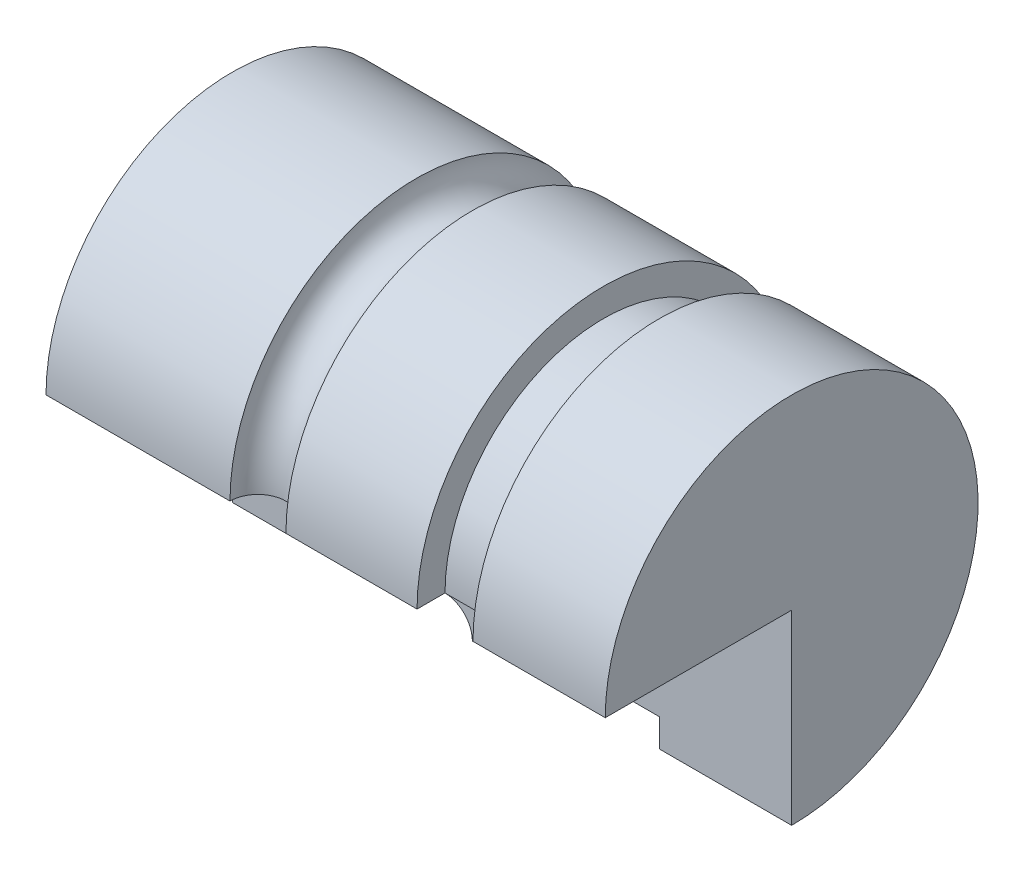
ISO-10303-21;
HEADER;
FILE_DESCRIPTION(('STEP AP214'),'2;1');
FILE_NAME('part.step','',(''),(''),'','','');
FILE_SCHEMA(('AUTOMOTIVE_DESIGN { 1 0 10303 214 1 1 1 1 }'));
ENDSEC;
DATA;
#1=APPLICATION_CONTEXT('core data for automotive mechanical design processes');
#2=APPLICATION_PROTOCOL_DEFINITION('international standard','automotive_design',2000,#1);
#3=PRODUCT_CONTEXT('',#1,'mechanical');
#4=PRODUCT('Part','Part','',(#3));
#5=PRODUCT_RELATED_PRODUCT_CATEGORY('part','',(#4));
#6=PRODUCT_DEFINITION_FORMATION('','',#4);
#7=PRODUCT_DEFINITION_CONTEXT('part definition',#1,'design');
#8=PRODUCT_DEFINITION('design','',#6,#7);
#9=PRODUCT_DEFINITION_SHAPE('','',#8);
#10=(LENGTH_UNIT() NAMED_UNIT(*) SI_UNIT(.MILLI.,.METRE.));
#11=(NAMED_UNIT(*) PLANE_ANGLE_UNIT() SI_UNIT($,.RADIAN.));
#12=(NAMED_UNIT(*) SI_UNIT($,.STERADIAN.) SOLID_ANGLE_UNIT());
#13=UNCERTAINTY_MEASURE_WITH_UNIT(LENGTH_MEASURE(1.E-05),#10,'distance_accuracy_value','');
#14=(GEOMETRIC_REPRESENTATION_CONTEXT(3) GLOBAL_UNCERTAINTY_ASSIGNED_CONTEXT((#13)) GLOBAL_UNIT_ASSIGNED_CONTEXT((#10,
#11,#12)) REPRESENTATION_CONTEXT('',''));
#15=CARTESIAN_POINT('',(0.,0.,0.));
#16=DIRECTION('',(0.,0.,1.));
#17=DIRECTION('',(1.,0.,0.));
#18=AXIS2_PLACEMENT_3D('',#15,#16,#17);
#19=CARTESIAN_POINT('',(0.,0.,0.));
#20=DIRECTION('',(-1.,0.,0.));
#21=DIRECTION('',(0.,0.,1.));
#22=AXIS2_PLACEMENT_3D('',#19,#20,#21);
#23=CYLINDRICAL_SURFACE('',#22,10.);
#24=CARTESIAN_POINT('',(12.8706836782184,0.,0.));
#25=DIRECTION('',(-1.,0.,0.));
#26=DIRECTION('',(0.,0.,1.));
#27=AXIS2_PLACEMENT_3D('',#24,#25,#26);
#28=CIRCLE('',#27,10.);
#29=CARTESIAN_POINT('',(12.8706836782184,0.,10.));
#30=VERTEX_POINT('',#29);
#31=CARTESIAN_POINT('',(12.8706836782184,-10.,0.));
#32=VERTEX_POINT('',#31);
#33=EDGE_CURVE('E165',#30,#32,#28,.T.);
#34=ORIENTED_EDGE('',*,*,#33,.F.);
#35=DIRECTION('',(-1.,0.,0.));
#36=VECTOR('',#35,1.);
#37=CARTESIAN_POINT('',(0.,0.,10.));
#38=LINE('',#37,#36);
#39=CARTESIAN_POINT('',(19.9044815159211,0.,10.));
#40=VERTEX_POINT('',#39);
#41=EDGE_CURVE('E148',#30,#40,#38,.F.);
#42=ORIENTED_EDGE('',*,*,#41,.T.);
#43=CARTESIAN_POINT('',(19.9044815159211,0.,0.));
#44=DIRECTION('',(1.,0.,0.));
#45=DIRECTION('',(0.,0.,-1.));
#46=AXIS2_PLACEMENT_3D('',#43,#44,#45);
#47=CIRCLE('',#46,10.);
#48=CARTESIAN_POINT('',(19.9044815159211,-10.,0.));
#49=VERTEX_POINT('',#48);
#50=EDGE_CURVE('E168',#49,#40,#47,.T.);
#51=ORIENTED_EDGE('',*,*,#50,.F.);
#52=DIRECTION('',(-1.,0.,0.));
#53=VECTOR('',#52,1.);
#54=CARTESIAN_POINT('',(0.,-10.,0.));
#55=LINE('',#54,#53);
#56=EDGE_CURVE('E135',#32,#49,#55,.F.);
#57=ORIENTED_EDGE('',*,*,#56,.F.);
#58=EDGE_LOOP('',(#34,#42,#51,#57));
#59=FACE_BOUND('',#58,.T.);
#60=ADVANCED_FACE('F35',(#59),#23,.T.);
#61=CARTESIAN_POINT('',(0.,0.,0.));
#62=DIRECTION('',(-1.,0.,0.));
#63=DIRECTION('',(0.,0.,1.));
#64=AXIS2_PLACEMENT_3D('',#61,#62,#63);
#65=CIRCLE('',#64,10.);
#66=CARTESIAN_POINT('',(0.,0.,10.));
#67=VERTEX_POINT('',#66);
#68=CARTESIAN_POINT('',(0.,-10.,0.));
#69=VERTEX_POINT('',#68);
#70=EDGE_CURVE('E122',#67,#69,#65,.T.);
#71=ORIENTED_EDGE('',*,*,#70,.F.);
#72=DIRECTION('',(-1.,0.,0.));
#73=VECTOR('',#72,1.);
#74=CARTESIAN_POINT('',(0.,0.,10.));
#75=LINE('',#74,#73);
#76=CARTESIAN_POINT('',(9.87068367821836,0.,10.));
#77=VERTEX_POINT('',#76);
#78=EDGE_CURVE('E117',#67,#77,#75,.F.);
#79=ORIENTED_EDGE('',*,*,#78,.T.);
#80=CARTESIAN_POINT('',(9.87068367821836,0.,0.));
#81=DIRECTION('',(1.,0.,0.));
#82=DIRECTION('',(0.,0.,-1.));
#83=AXIS2_PLACEMENT_3D('',#80,#81,#82);
#84=CIRCLE('',#83,10.);
#85=CARTESIAN_POINT('',(9.87068367821836,-10.,0.));
#86=VERTEX_POINT('',#85);
#87=EDGE_CURVE('E163',#86,#77,#84,.T.);
#88=ORIENTED_EDGE('',*,*,#87,.F.);
#89=DIRECTION('',(-1.,0.,0.));
#90=VECTOR('',#89,1.);
#91=CARTESIAN_POINT('',(0.,-10.,0.));
#92=LINE('',#91,#90);
#93=EDGE_CURVE('E140',#69,#86,#92,.F.);
#94=ORIENTED_EDGE('',*,*,#93,.F.);
#95=EDGE_LOOP('',(#71,#79,#88,#94));
#96=FACE_BOUND('',#95,.T.);
#97=ADVANCED_FACE('F199',(#96),#23,.T.);
#98=CARTESIAN_POINT('',(0.,0.,0.));
#99=DIRECTION('',(1.,0.,0.));
#100=DIRECTION('',(0.,0.,-1.));
#101=AXIS2_PLACEMENT_3D('',#98,#99,#100);
#102=PLANE('',#101);
#103=DIRECTION('',(0.,-1.,0.));
#104=VECTOR('',#103,1.);
#105=CARTESIAN_POINT('',(0.,0.,0.));
#106=LINE('',#105,#104);
#107=CARTESIAN_POINT('',(0.,0.,0.));
#108=VERTEX_POINT('',#107);
#109=EDGE_CURVE('E108',#108,#69,#106,.T.);
#110=ORIENTED_EDGE('',*,*,#109,.F.);
#111=DIRECTION('',(0.,0.,1.));
#112=VECTOR('',#111,1.);
#113=CARTESIAN_POINT('',(0.,0.,0.));
#114=LINE('',#113,#112);
#115=EDGE_CURVE('E115',#108,#67,#114,.T.);
#116=ORIENTED_EDGE('',*,*,#115,.T.);
#117=ORIENTED_EDGE('',*,*,#70,.T.);
#118=EDGE_LOOP('',(#110,#116,#117));
#119=FACE_BOUND('',#118,.T.);
#120=ADVANCED_FACE('F37',(#119),#102,.F.);
#121=CARTESIAN_POINT('',(11.3706836782184,0.,0.));
#122=DIRECTION('',(-1.,0.,0.));
#123=DIRECTION('',(0.,0.,1.));
#124=AXIS2_PLACEMENT_3D('',#121,#122,#123);
#125=TOROIDAL_SURFACE('',#124,10.,1.5);
#126=CARTESIAN_POINT('',(11.3706836782184,0.,10.));
#127=DIRECTION('',(0.,1.,0.));
#128=DIRECTION('',(0.,0.,1.));
#129=AXIS2_PLACEMENT_3D('',#126,#127,#128);
#130=CIRCLE('',#129,1.5);
#131=EDGE_CURVE('E58',#30,#77,#130,.T.);
#132=ORIENTED_EDGE('',*,*,#131,.F.);
#133=ORIENTED_EDGE('',*,*,#33,.T.);
#134=CARTESIAN_POINT('',(11.3706836782184,-10.,0.));
#135=DIRECTION('',(0.,0.,1.));
#136=DIRECTION('',(1.,0.,0.));
#137=AXIS2_PLACEMENT_3D('',#134,#135,#136);
#138=CIRCLE('',#137,1.5);
#139=EDGE_CURVE('E137',#32,#86,#138,.T.);
#140=ORIENTED_EDGE('',*,*,#139,.T.);
#141=ORIENTED_EDGE('',*,*,#87,.T.);
#142=EDGE_LOOP('',(#132,#133,#140,#141));
#143=FACE_BOUND('',#142,.T.);
#144=ADVANCED_FACE('F196',(#143),#125,.F.);
#145=CARTESIAN_POINT('',(19.9044815159211,0.,-11.0012855731198));
#146=DIRECTION('',(1.,0.,0.));
#147=DIRECTION('',(0.,0.,-1.));
#148=AXIS2_PLACEMENT_3D('',#145,#146,#147);
#149=PLANE('',#148);
#150=DIRECTION('',(0.,0.,1.));
#151=VECTOR('',#150,1.);
#152=CARTESIAN_POINT('',(19.9044815159211,0.,-11.0012855731198));
#153=LINE('',#152,#151);
#154=CARTESIAN_POINT('',(19.9044815159211,0.,8.5));
#155=VERTEX_POINT('',#154);
#156=EDGE_CURVE('E146',#155,#40,#153,.T.);
#157=ORIENTED_EDGE('',*,*,#156,.F.);
#158=CARTESIAN_POINT('',(19.9044815159211,0.,0.));
#159=DIRECTION('',(-1.,0.,0.));
#160=DIRECTION('',(0.,0.,1.));
#161=AXIS2_PLACEMENT_3D('',#158,#159,#160);
#162=CIRCLE('',#161,8.5);
#163=CARTESIAN_POINT('',(19.9044815159211,-8.5,0.));
#164=VERTEX_POINT('',#163);
#165=EDGE_CURVE('E156',#155,#164,#162,.T.);
#166=ORIENTED_EDGE('',*,*,#165,.T.);
#167=DIRECTION('',(0.,-1.,0.));
#168=VECTOR('',#167,1.);
#169=CARTESIAN_POINT('',(19.9044815159211,0.,0.));
#170=LINE('',#169,#168);
#171=EDGE_CURVE('E132',#164,#49,#170,.T.);
#172=ORIENTED_EDGE('',*,*,#171,.T.);
#173=ORIENTED_EDGE('',*,*,#50,.T.);
#174=EDGE_LOOP('',(#157,#166,#172,#173));
#175=FACE_BOUND('',#174,.T.);
#176=ADVANCED_FACE('F190',(#175),#149,.T.);
#177=CARTESIAN_POINT('',(22.9044815159211,0.,-11.0012855731198));
#178=DIRECTION('',(-1.,0.,0.));
#179=DIRECTION('',(0.,0.,1.));
#180=AXIS2_PLACEMENT_3D('',#177,#178,#179);
#181=PLANE('',#180);
#182=DIRECTION('',(0.,0.,-1.));
#183=VECTOR('',#182,1.);
#184=CARTESIAN_POINT('',(22.9044815159211,0.,-11.0012855731198));
#185=LINE('',#184,#183);
#186=CARTESIAN_POINT('',(22.9044815159211,0.,10.));
#187=VERTEX_POINT('',#186);
#188=CARTESIAN_POINT('',(22.9044815159211,0.,8.5));
#189=VERTEX_POINT('',#188);
#190=EDGE_CURVE('E142',#187,#189,#185,.T.);
#191=ORIENTED_EDGE('',*,*,#190,.F.);
#192=CARTESIAN_POINT('',(22.9044815159211,0.,0.));
#193=DIRECTION('',(-1.,0.,0.));
#194=DIRECTION('',(0.,0.,1.));
#195=AXIS2_PLACEMENT_3D('',#192,#193,#194);
#196=CIRCLE('',#195,10.);
#197=CARTESIAN_POINT('',(22.9044815159211,-10.,0.));
#198=VERTEX_POINT('',#197);
#199=EDGE_CURVE('E159',#187,#198,#196,.T.);
#200=ORIENTED_EDGE('',*,*,#199,.T.);
#201=DIRECTION('',(0.,1.,0.));
#202=VECTOR('',#201,1.);
#203=CARTESIAN_POINT('',(22.9044815159211,0.,0.));
#204=LINE('',#203,#202);
#205=CARTESIAN_POINT('',(22.9044815159211,-8.5,0.));
#206=VERTEX_POINT('',#205);
#207=EDGE_CURVE('E50',#198,#206,#204,.T.);
#208=ORIENTED_EDGE('',*,*,#207,.T.);
#209=CARTESIAN_POINT('',(22.9044815159211,0.,0.));
#210=DIRECTION('',(-1.,0.,0.));
#211=DIRECTION('',(0.,0.,1.));
#212=AXIS2_PLACEMENT_3D('',#209,#210,#211);
#213=CIRCLE('',#212,8.5);
#214=EDGE_CURVE('E153',#189,#206,#213,.T.);
#215=ORIENTED_EDGE('',*,*,#214,.F.);
#216=EDGE_LOOP('',(#191,#200,#208,#215));
#217=FACE_BOUND('',#216,.T.);
#218=ADVANCED_FACE('F184',(#217),#181,.T.);
#219=CARTESIAN_POINT('',(0.,0.,0.));
#220=DIRECTION('',(-1.,0.,0.));
#221=DIRECTION('',(0.,0.,1.));
#222=AXIS2_PLACEMENT_3D('',#219,#220,#221);
#223=CYLINDRICAL_SURFACE('',#222,8.5);
#224=DIRECTION('',(-1.,0.,0.));
#225=VECTOR('',#224,1.);
#226=CARTESIAN_POINT('',(0.,0.,8.5));
#227=LINE('',#226,#225);
#228=EDGE_CURVE('E144',#189,#155,#227,.T.);
#229=ORIENTED_EDGE('',*,*,#228,.F.);
#230=ORIENTED_EDGE('',*,*,#214,.T.);
#231=DIRECTION('',(-1.,0.,0.));
#232=VECTOR('',#231,1.);
#233=CARTESIAN_POINT('',(0.,-8.5,0.));
#234=LINE('',#233,#232);
#235=EDGE_CURVE('E129',#206,#164,#234,.T.);
#236=ORIENTED_EDGE('',*,*,#235,.T.);
#237=ORIENTED_EDGE('',*,*,#165,.F.);
#238=EDGE_LOOP('',(#229,#230,#236,#237));
#239=FACE_BOUND('',#238,.T.);
#240=ADVANCED_FACE('F186',(#239),#223,.T.);
#241=CARTESIAN_POINT('',(30.,10.,0.));
#242=DIRECTION('',(-1.,0.,0.));
#243=DIRECTION('',(0.,0.,1.));
#244=AXIS2_PLACEMENT_3D('',#241,#242,#243);
#245=PLANE('',#244);
#246=CARTESIAN_POINT('',(30.,0.,0.));
#247=DIRECTION('',(-1.,0.,0.));
#248=DIRECTION('',(0.,0.,1.));
#249=AXIS2_PLACEMENT_3D('',#246,#247,#248);
#250=CIRCLE('',#249,10.);
#251=CARTESIAN_POINT('',(30.,0.,10.));
#252=VERTEX_POINT('',#251);
#253=CARTESIAN_POINT('',(30.,-10.,0.));
#254=VERTEX_POINT('',#253);
#255=EDGE_CURVE('E160',#252,#254,#250,.T.);
#256=ORIENTED_EDGE('',*,*,#255,.F.);
#257=DIRECTION('',(0.,0.,1.));
#258=VECTOR('',#257,1.);
#259=CARTESIAN_POINT('',(30.,0.,0.));
#260=LINE('',#259,#258);
#261=CARTESIAN_POINT('',(30.,0.,0.));
#262=VERTEX_POINT('',#261);
#263=EDGE_CURVE('E125',#262,#252,#260,.T.);
#264=ORIENTED_EDGE('',*,*,#263,.F.);
#265=DIRECTION('',(0.,-1.,0.));
#266=VECTOR('',#265,1.);
#267=CARTESIAN_POINT('',(30.,0.,0.));
#268=LINE('',#267,#266);
#269=EDGE_CURVE('E111',#262,#254,#268,.T.);
#270=ORIENTED_EDGE('',*,*,#269,.T.);
#271=EDGE_LOOP('',(#256,#264,#270));
#272=FACE_BOUND('',#271,.T.);
#273=ADVANCED_FACE('F178',(#272),#245,.F.);
#274=ORIENTED_EDGE('',*,*,#199,.F.);
#275=DIRECTION('',(-1.,0.,0.));
#276=VECTOR('',#275,1.);
#277=CARTESIAN_POINT('',(0.,0.,10.));
#278=LINE('',#277,#276);
#279=EDGE_CURVE('E11',#187,#252,#278,.F.);
#280=ORIENTED_EDGE('',*,*,#279,.T.);
#281=ORIENTED_EDGE('',*,*,#255,.T.);
#282=DIRECTION('',(-1.,0.,0.));
#283=VECTOR('',#282,1.);
#284=CARTESIAN_POINT('',(0.,-10.,0.));
#285=LINE('',#284,#283);
#286=EDGE_CURVE('E43',#198,#254,#285,.F.);
#287=ORIENTED_EDGE('',*,*,#286,.F.);
#288=EDGE_LOOP('',(#274,#280,#281,#287));
#289=FACE_BOUND('',#288,.T.);
#290=ADVANCED_FACE('F179',(#289),#23,.T.);
#291=CARTESIAN_POINT('',(0.,0.,0.));
#292=DIRECTION('',(0.,1.,0.));
#293=DIRECTION('',(0.,0.,1.));
#294=AXIS2_PLACEMENT_3D('',#291,#292,#293);
#295=PLANE('',#294);
#296=ORIENTED_EDGE('',*,*,#115,.F.);
#297=DIRECTION('',(1.,0.,0.));
#298=VECTOR('',#297,1.);
#299=CARTESIAN_POINT('',(0.,0.,0.));
#300=LINE('',#299,#298);
#301=EDGE_CURVE('E104',#108,#262,#300,.T.);
#302=ORIENTED_EDGE('',*,*,#301,.T.);
#303=ORIENTED_EDGE('',*,*,#263,.T.);
#304=ORIENTED_EDGE('',*,*,#279,.F.);
#305=ORIENTED_EDGE('',*,*,#190,.T.);
#306=ORIENTED_EDGE('',*,*,#228,.T.);
#307=ORIENTED_EDGE('',*,*,#156,.T.);
#308=ORIENTED_EDGE('',*,*,#41,.F.);
#309=ORIENTED_EDGE('',*,*,#131,.T.);
#310=ORIENTED_EDGE('',*,*,#78,.F.);
#311=EDGE_LOOP('',(#296,#302,#303,#304,#305,#306,#307,#308,#309,#310));
#312=FACE_BOUND('',#311,.T.);
#313=ADVANCED_FACE('F116',(#312),#295,.F.);
#314=CARTESIAN_POINT('',(0.,0.,0.));
#315=DIRECTION('',(0.,0.,1.));
#316=DIRECTION('',(1.,0.,0.));
#317=AXIS2_PLACEMENT_3D('',#314,#315,#316);
#318=PLANE('',#317);
#319=ORIENTED_EDGE('',*,*,#93,.T.);
#320=ORIENTED_EDGE('',*,*,#139,.F.);
#321=ORIENTED_EDGE('',*,*,#56,.T.);
#322=ORIENTED_EDGE('',*,*,#171,.F.);
#323=ORIENTED_EDGE('',*,*,#235,.F.);
#324=ORIENTED_EDGE('',*,*,#207,.F.);
#325=ORIENTED_EDGE('',*,*,#286,.T.);
#326=ORIENTED_EDGE('',*,*,#269,.F.);
#327=ORIENTED_EDGE('',*,*,#301,.F.);
#328=ORIENTED_EDGE('',*,*,#109,.T.);
#329=EDGE_LOOP('',(#319,#320,#321,#322,#323,#324,#325,#326,#327,#328));
#330=FACE_BOUND('',#329,.T.);
#331=ADVANCED_FACE('F106',(#330),#318,.T.);
#332=CLOSED_SHELL('',(#60,#97,#120,#144,#176,#218,#240,#273,#290,#313,#331));
#333=MANIFOLD_SOLID_BREP('B2',#332);
#334=ADVANCED_BREP_SHAPE_REPRESENTATION('',(#18,#333),#14);
#335=SHAPE_DEFINITION_REPRESENTATION(#9,#334);
ENDSEC;
END-ISO-10303-21;
